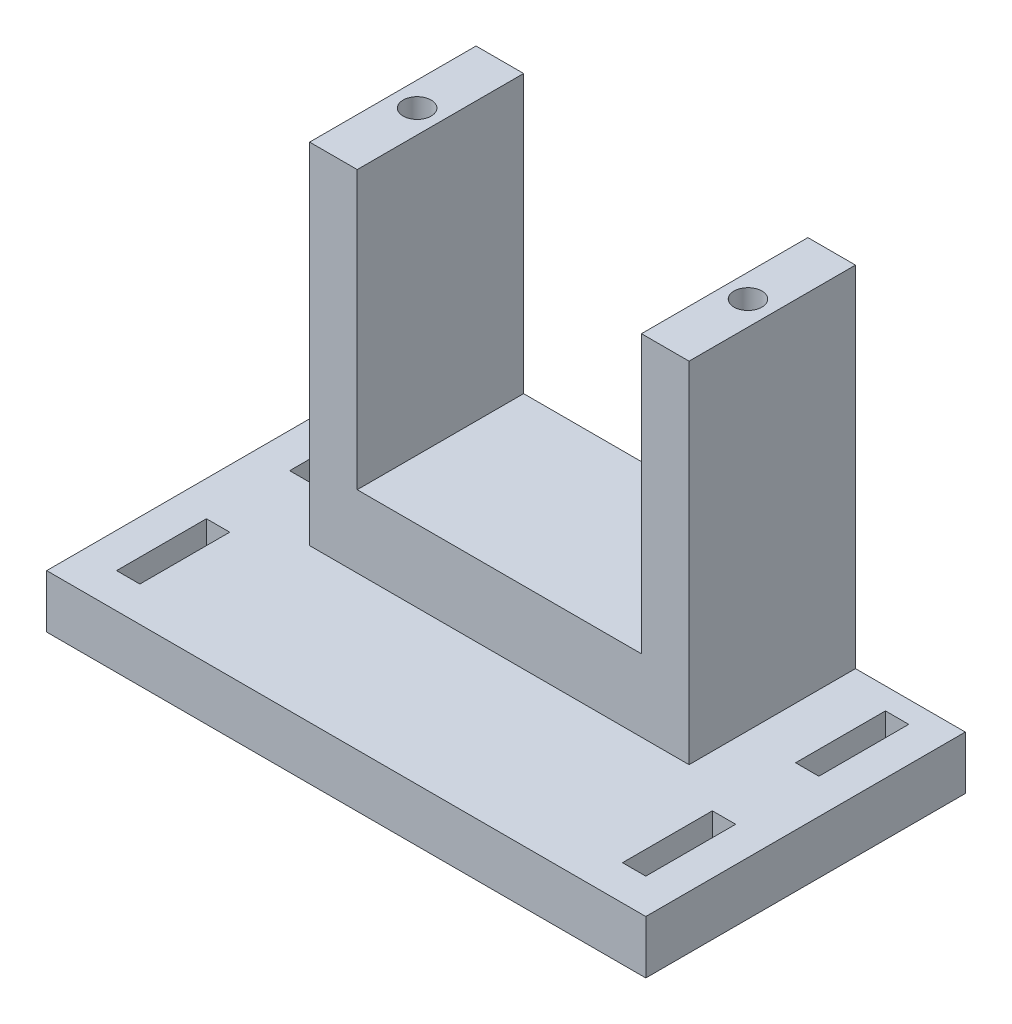
ISO-10303-21;
HEADER;
FILE_DESCRIPTION(('STEP AP214'),'2;1');
FILE_NAME('part.step','',(''),(''),'','','');
FILE_SCHEMA(('AUTOMOTIVE_DESIGN { 1 0 10303 214 1 1 1 1 }'));
ENDSEC;
DATA;
#1=APPLICATION_CONTEXT('core data for automotive mechanical design processes');
#2=APPLICATION_PROTOCOL_DEFINITION('international standard','automotive_design',2000,#1);
#3=PRODUCT_CONTEXT('',#1,'mechanical');
#4=PRODUCT('Part','Part','',(#3));
#5=PRODUCT_RELATED_PRODUCT_CATEGORY('part','',(#4));
#6=PRODUCT_DEFINITION_FORMATION('','',#4);
#7=PRODUCT_DEFINITION_CONTEXT('part definition',#1,'design');
#8=PRODUCT_DEFINITION('design','',#6,#7);
#9=PRODUCT_DEFINITION_SHAPE('','',#8);
#10=(LENGTH_UNIT() NAMED_UNIT(*) SI_UNIT(.MILLI.,.METRE.));
#11=(NAMED_UNIT(*) PLANE_ANGLE_UNIT() SI_UNIT($,.RADIAN.));
#12=(NAMED_UNIT(*) SI_UNIT($,.STERADIAN.) SOLID_ANGLE_UNIT());
#13=UNCERTAINTY_MEASURE_WITH_UNIT(LENGTH_MEASURE(1.E-05),#10,'distance_accuracy_value','');
#14=(GEOMETRIC_REPRESENTATION_CONTEXT(3) GLOBAL_UNCERTAINTY_ASSIGNED_CONTEXT((#13)) GLOBAL_UNIT_ASSIGNED_CONTEXT((#10,
#11,#12)) REPRESENTATION_CONTEXT('',''));
#15=CARTESIAN_POINT('',(0.,0.,0.));
#16=DIRECTION('',(0.,0.,1.));
#17=DIRECTION('',(1.,0.,0.));
#18=AXIS2_PLACEMENT_3D('',#15,#16,#17);
#19=CARTESIAN_POINT('',(36.25,0.,42.75));
#20=DIRECTION('',(0.,0.,1.));
#21=DIRECTION('',(1.,0.,0.));
#22=AXIS2_PLACEMENT_3D('',#19,#20,#21);
#23=PLANE('',#22);
#24=DIRECTION('',(1.,0.,0.));
#25=VECTOR('',#24,1.);
#26=CARTESIAN_POINT('',(36.25,8.,42.75));
#27=LINE('',#26,#25);
#28=CARTESIAN_POINT('',(36.25,8.,42.75));
#29=VERTEX_POINT('',#28);
#30=CARTESIAN_POINT('',(39.75,8.,42.75));
#31=VERTEX_POINT('',#30);
#32=EDGE_CURVE('E507',#29,#31,#27,.T.);
#33=ORIENTED_EDGE('',*,*,#32,.T.);
#34=DIRECTION('',(0.,1.,0.));
#35=VECTOR('',#34,1.);
#36=CARTESIAN_POINT('',(39.75,0.,42.75));
#37=LINE('',#36,#35);
#38=CARTESIAN_POINT('',(39.75,0.,42.75));
#39=VERTEX_POINT('',#38);
#40=EDGE_CURVE('E11',#39,#31,#37,.T.);
#41=ORIENTED_EDGE('',*,*,#40,.F.);
#42=DIRECTION('',(1.,0.,0.));
#43=VECTOR('',#42,1.);
#44=CARTESIAN_POINT('',(36.25,0.,42.75));
#45=LINE('',#44,#43);
#46=CARTESIAN_POINT('',(36.25,0.,42.75));
#47=VERTEX_POINT('',#46);
#48=EDGE_CURVE('E513',#47,#39,#45,.T.);
#49=ORIENTED_EDGE('',*,*,#48,.F.);
#50=DIRECTION('',(0.,1.,0.));
#51=VECTOR('',#50,1.);
#52=CARTESIAN_POINT('',(36.25,0.,42.75));
#53=LINE('',#52,#51);
#54=EDGE_CURVE('E523',#47,#29,#53,.T.);
#55=ORIENTED_EDGE('',*,*,#54,.T.);
#56=EDGE_LOOP('',(#33,#41,#49,#55));
#57=FACE_BOUND('',#56,.T.);
#58=ADVANCED_FACE('F44',(#57),#23,.F.);
#59=CARTESIAN_POINT('',(39.75,0.,29.25));
#60=DIRECTION('',(1.,0.,0.));
#61=DIRECTION('',(0.,0.,-1.));
#62=AXIS2_PLACEMENT_3D('',#59,#60,#61);
#63=PLANE('',#62);
#64=DIRECTION('',(0.,0.,-1.));
#65=VECTOR('',#64,1.);
#66=CARTESIAN_POINT('',(39.75,8.,29.25));
#67=LINE('',#66,#65);
#68=CARTESIAN_POINT('',(39.75,8.,29.25));
#69=VERTEX_POINT('',#68);
#70=EDGE_CURVE('E502',#31,#69,#67,.T.);
#71=ORIENTED_EDGE('',*,*,#70,.T.);
#72=DIRECTION('',(0.,1.,0.));
#73=VECTOR('',#72,1.);
#74=CARTESIAN_POINT('',(39.75,0.,29.25));
#75=LINE('',#74,#73);
#76=CARTESIAN_POINT('',(39.75,0.,29.25));
#77=VERTEX_POINT('',#76);
#78=EDGE_CURVE('E52',#77,#69,#75,.T.);
#79=ORIENTED_EDGE('',*,*,#78,.F.);
#80=DIRECTION('',(0.,0.,-1.));
#81=VECTOR('',#80,1.);
#82=CARTESIAN_POINT('',(39.75,0.,29.25));
#83=LINE('',#82,#81);
#84=EDGE_CURVE('E70',#39,#77,#83,.T.);
#85=ORIENTED_EDGE('',*,*,#84,.F.);
#86=ORIENTED_EDGE('',*,*,#40,.T.);
#87=EDGE_LOOP('',(#71,#79,#85,#86));
#88=FACE_BOUND('',#87,.T.);
#89=ADVANCED_FACE('F536',(#88),#63,.F.);
#90=CARTESIAN_POINT('',(36.25,0.,29.25));
#91=DIRECTION('',(0.,0.,-1.));
#92=DIRECTION('',(-1.,0.,0.));
#93=AXIS2_PLACEMENT_3D('',#90,#91,#92);
#94=PLANE('',#93);
#95=DIRECTION('',(-1.,0.,0.));
#96=VECTOR('',#95,1.);
#97=CARTESIAN_POINT('',(36.25,8.,29.25));
#98=LINE('',#97,#96);
#99=CARTESIAN_POINT('',(36.25,8.,29.25));
#100=VERTEX_POINT('',#99);
#101=EDGE_CURVE('E504',#69,#100,#98,.T.);
#102=ORIENTED_EDGE('',*,*,#101,.T.);
#103=DIRECTION('',(0.,1.,0.));
#104=VECTOR('',#103,1.);
#105=CARTESIAN_POINT('',(36.25,0.,29.25));
#106=LINE('',#105,#104);
#107=CARTESIAN_POINT('',(36.25,0.,29.25));
#108=VERTEX_POINT('',#107);
#109=EDGE_CURVE('E527',#108,#100,#106,.T.);
#110=ORIENTED_EDGE('',*,*,#109,.F.);
#111=DIRECTION('',(-1.,0.,0.));
#112=VECTOR('',#111,1.);
#113=CARTESIAN_POINT('',(36.25,0.,29.25));
#114=LINE('',#113,#112);
#115=EDGE_CURVE('E517',#77,#108,#114,.T.);
#116=ORIENTED_EDGE('',*,*,#115,.F.);
#117=ORIENTED_EDGE('',*,*,#78,.T.);
#118=EDGE_LOOP('',(#102,#110,#116,#117));
#119=FACE_BOUND('',#118,.T.);
#120=ADVANCED_FACE('F531',(#119),#94,.F.);
#121=CARTESIAN_POINT('',(36.25,0.,29.25));
#122=DIRECTION('',(-1.,0.,0.));
#123=DIRECTION('',(0.,0.,1.));
#124=AXIS2_PLACEMENT_3D('',#121,#122,#123);
#125=PLANE('',#124);
#126=DIRECTION('',(0.,0.,1.));
#127=VECTOR('',#126,1.);
#128=CARTESIAN_POINT('',(36.25,8.,29.25));
#129=LINE('',#128,#127);
#130=EDGE_CURVE('E499',#100,#29,#129,.T.);
#131=ORIENTED_EDGE('',*,*,#130,.T.);
#132=ORIENTED_EDGE('',*,*,#54,.F.);
#133=DIRECTION('',(0.,0.,1.));
#134=VECTOR('',#133,1.);
#135=CARTESIAN_POINT('',(36.25,0.,29.25));
#136=LINE('',#135,#134);
#137=EDGE_CURVE('E58',#108,#47,#136,.T.);
#138=ORIENTED_EDGE('',*,*,#137,.F.);
#139=ORIENTED_EDGE('',*,*,#109,.T.);
#140=EDGE_LOOP('',(#131,#132,#138,#139));
#141=FACE_BOUND('',#140,.T.);
#142=ADVANCED_FACE('F545',(#141),#125,.F.);
#143=CARTESIAN_POINT('',(-39.75,0.,42.75));
#144=DIRECTION('',(0.,0.,1.));
#145=DIRECTION('',(1.,0.,0.));
#146=AXIS2_PLACEMENT_3D('',#143,#144,#145);
#147=PLANE('',#146);
#148=DIRECTION('',(1.,0.,0.));
#149=VECTOR('',#148,1.);
#150=CARTESIAN_POINT('',(-39.75,8.,42.75));
#151=LINE('',#150,#149);
#152=CARTESIAN_POINT('',(-39.75,8.,42.75));
#153=VERTEX_POINT('',#152);
#154=CARTESIAN_POINT('',(-36.25,8.,42.75));
#155=VERTEX_POINT('',#154);
#156=EDGE_CURVE('E462',#153,#155,#151,.T.);
#157=ORIENTED_EDGE('',*,*,#156,.T.);
#158=DIRECTION('',(0.,1.,0.));
#159=VECTOR('',#158,1.);
#160=CARTESIAN_POINT('',(-36.25,0.,42.75));
#161=LINE('',#160,#159);
#162=CARTESIAN_POINT('',(-36.25,0.,42.75));
#163=VERTEX_POINT('',#162);
#164=EDGE_CURVE('E493',#163,#155,#161,.T.);
#165=ORIENTED_EDGE('',*,*,#164,.F.);
#166=DIRECTION('',(1.,0.,0.));
#167=VECTOR('',#166,1.);
#168=CARTESIAN_POINT('',(-39.75,0.,42.75));
#169=LINE('',#168,#167);
#170=CARTESIAN_POINT('',(-39.75,0.,42.75));
#171=VERTEX_POINT('',#170);
#172=EDGE_CURVE('E472',#171,#163,#169,.T.);
#173=ORIENTED_EDGE('',*,*,#172,.F.);
#174=DIRECTION('',(0.,1.,0.));
#175=VECTOR('',#174,1.);
#176=CARTESIAN_POINT('',(-39.75,0.,42.75));
#177=LINE('',#176,#175);
#178=EDGE_CURVE('E485',#171,#153,#177,.T.);
#179=ORIENTED_EDGE('',*,*,#178,.T.);
#180=EDGE_LOOP('',(#157,#165,#173,#179));
#181=FACE_BOUND('',#180,.T.);
#182=ADVANCED_FACE('F542',(#181),#147,.F.);
#183=CARTESIAN_POINT('',(-36.25,0.,29.25));
#184=DIRECTION('',(1.,0.,0.));
#185=DIRECTION('',(0.,0.,-1.));
#186=AXIS2_PLACEMENT_3D('',#183,#184,#185);
#187=PLANE('',#186);
#188=DIRECTION('',(0.,0.,-1.));
#189=VECTOR('',#188,1.);
#190=CARTESIAN_POINT('',(-36.25,8.,29.25));
#191=LINE('',#190,#189);
#192=CARTESIAN_POINT('',(-36.25,8.,29.25));
#193=VERTEX_POINT('',#192);
#194=EDGE_CURVE('E464',#155,#193,#191,.T.);
#195=ORIENTED_EDGE('',*,*,#194,.T.);
#196=DIRECTION('',(0.,1.,0.));
#197=VECTOR('',#196,1.);
#198=CARTESIAN_POINT('',(-36.25,0.,29.25));
#199=LINE('',#198,#197);
#200=CARTESIAN_POINT('',(-36.25,0.,29.25));
#201=VERTEX_POINT('',#200);
#202=EDGE_CURVE('E489',#201,#193,#199,.T.);
#203=ORIENTED_EDGE('',*,*,#202,.F.);
#204=DIRECTION('',(0.,0.,-1.));
#205=VECTOR('',#204,1.);
#206=CARTESIAN_POINT('',(-36.25,0.,29.25));
#207=LINE('',#206,#205);
#208=EDGE_CURVE('E474',#163,#201,#207,.T.);
#209=ORIENTED_EDGE('',*,*,#208,.F.);
#210=ORIENTED_EDGE('',*,*,#164,.T.);
#211=EDGE_LOOP('',(#195,#203,#209,#210));
#212=FACE_BOUND('',#211,.T.);
#213=ADVANCED_FACE('F549',(#212),#187,.F.);
#214=CARTESIAN_POINT('',(-39.75,0.,29.25));
#215=DIRECTION('',(0.,0.,-1.));
#216=DIRECTION('',(-1.,0.,0.));
#217=AXIS2_PLACEMENT_3D('',#214,#215,#216);
#218=PLANE('',#217);
#219=DIRECTION('',(-1.,0.,0.));
#220=VECTOR('',#219,1.);
#221=CARTESIAN_POINT('',(-39.75,8.,29.25));
#222=LINE('',#221,#220);
#223=CARTESIAN_POINT('',(-39.75,8.,29.25));
#224=VERTEX_POINT('',#223);
#225=EDGE_CURVE('E460',#193,#224,#222,.T.);
#226=ORIENTED_EDGE('',*,*,#225,.T.);
#227=DIRECTION('',(0.,1.,0.));
#228=VECTOR('',#227,1.);
#229=CARTESIAN_POINT('',(-39.75,0.,29.25));
#230=LINE('',#229,#228);
#231=CARTESIAN_POINT('',(-39.75,0.,29.25));
#232=VERTEX_POINT('',#231);
#233=EDGE_CURVE('E486',#232,#224,#230,.T.);
#234=ORIENTED_EDGE('',*,*,#233,.F.);
#235=DIRECTION('',(-1.,0.,0.));
#236=VECTOR('',#235,1.);
#237=CARTESIAN_POINT('',(-39.75,0.,29.25));
#238=LINE('',#237,#236);
#239=EDGE_CURVE('E476',#201,#232,#238,.T.);
#240=ORIENTED_EDGE('',*,*,#239,.F.);
#241=ORIENTED_EDGE('',*,*,#202,.T.);
#242=EDGE_LOOP('',(#226,#234,#240,#241));
#243=FACE_BOUND('',#242,.T.);
#244=ADVANCED_FACE('F588',(#243),#218,.F.);
#245=CARTESIAN_POINT('',(-39.75,0.,29.25));
#246=DIRECTION('',(-1.,0.,0.));
#247=DIRECTION('',(0.,0.,1.));
#248=AXIS2_PLACEMENT_3D('',#245,#246,#247);
#249=PLANE('',#248);
#250=DIRECTION('',(0.,0.,1.));
#251=VECTOR('',#250,1.);
#252=CARTESIAN_POINT('',(-39.75,8.,29.25));
#253=LINE('',#252,#251);
#254=EDGE_CURVE('E452',#224,#153,#253,.T.);
#255=ORIENTED_EDGE('',*,*,#254,.T.);
#256=ORIENTED_EDGE('',*,*,#178,.F.);
#257=DIRECTION('',(0.,0.,1.));
#258=VECTOR('',#257,1.);
#259=CARTESIAN_POINT('',(-39.75,0.,29.25));
#260=LINE('',#259,#258);
#261=EDGE_CURVE('E467',#232,#171,#260,.T.);
#262=ORIENTED_EDGE('',*,*,#261,.F.);
#263=ORIENTED_EDGE('',*,*,#233,.T.);
#264=EDGE_LOOP('',(#255,#256,#262,#263));
#265=FACE_BOUND('',#264,.T.);
#266=ADVANCED_FACE('F596',(#265),#249,.F.);
#267=CARTESIAN_POINT('',(-28.5,60.5,25.));
#268=DIRECTION('',(0.,-1.,0.));
#269=DIRECTION('',(0.,0.,-1.));
#270=AXIS2_PLACEMENT_3D('',#267,#268,#269);
#271=PLANE('',#270);
#272=CARTESIAN_POINT('',(-24.85,60.5,12.5));
#273=DIRECTION('',(0.,1.,0.));
#274=DIRECTION('',(0.,0.,1.));
#275=AXIS2_PLACEMENT_3D('',#272,#273,#274);
#276=CIRCLE('',#275,2.1);
#277=CARTESIAN_POINT('',(-24.85,60.5,14.6));
#278=VERTEX_POINT('',#277);
#279=EDGE_CURVE('E805',#278,#278,#276,.T.);
#280=ORIENTED_EDGE('',*,*,#279,.F.);
#281=EDGE_LOOP('',(#280));
#282=FACE_BOUND('',#281,.T.);
#283=DIRECTION('',(-1.,0.,0.));
#284=VECTOR('',#283,1.);
#285=CARTESIAN_POINT('',(-28.5,60.5,25.));
#286=LINE('',#285,#284);
#287=CARTESIAN_POINT('',(-21.35,60.5,25.));
#288=VERTEX_POINT('',#287);
#289=CARTESIAN_POINT('',(-28.5,60.5,25.));
#290=VERTEX_POINT('',#289);
#291=EDGE_CURVE('E416',#288,#290,#286,.T.);
#292=ORIENTED_EDGE('',*,*,#291,.F.);
#293=DIRECTION('',(0.,0.,-1.));
#294=VECTOR('',#293,1.);
#295=CARTESIAN_POINT('',(-21.35,60.5,25.));
#296=LINE('',#295,#294);
#297=CARTESIAN_POINT('',(-21.35,60.5,0.));
#298=VERTEX_POINT('',#297);
#299=EDGE_CURVE('E449',#288,#298,#296,.T.);
#300=ORIENTED_EDGE('',*,*,#299,.T.);
#301=DIRECTION('',(-1.,0.,0.));
#302=VECTOR('',#301,1.);
#303=CARTESIAN_POINT('',(-28.5,60.5,0.));
#304=LINE('',#303,#302);
#305=CARTESIAN_POINT('',(-28.5,60.5,0.));
#306=VERTEX_POINT('',#305);
#307=EDGE_CURVE('E433',#298,#306,#304,.T.);
#308=ORIENTED_EDGE('',*,*,#307,.T.);
#309=DIRECTION('',(0.,0.,-1.));
#310=VECTOR('',#309,1.);
#311=CARTESIAN_POINT('',(-28.5,60.5,25.));
#312=LINE('',#311,#310);
#313=EDGE_CURVE('E421',#290,#306,#312,.T.);
#314=ORIENTED_EDGE('',*,*,#313,.F.);
#315=EDGE_LOOP('',(#292,#300,#308,#314));
#316=FACE_BOUND('',#315,.T.);
#317=ADVANCED_FACE('F607',(#282,#316),#271,.F.);
#318=CARTESIAN_POINT('',(0.,0.,25.));
#319=DIRECTION('',(0.,0.,-1.));
#320=DIRECTION('',(-1.,0.,0.));
#321=AXIS2_PLACEMENT_3D('',#318,#319,#320);
#322=PLANE('',#321);
#323=DIRECTION('',(0.,-1.,0.));
#324=VECTOR('',#323,1.);
#325=CARTESIAN_POINT('',(-28.5,0.,25.));
#326=LINE('',#325,#324);
#327=CARTESIAN_POINT('',(-28.5,8.,25.));
#328=VERTEX_POINT('',#327);
#329=EDGE_CURVE('E407',#290,#328,#326,.T.);
#330=ORIENTED_EDGE('',*,*,#329,.T.);
#331=DIRECTION('',(1.,0.,0.));
#332=VECTOR('',#331,1.);
#333=CARTESIAN_POINT('',(0.,8.,25.));
#334=LINE('',#333,#332);
#335=CARTESIAN_POINT('',(28.5,8.,25.));
#336=VERTEX_POINT('',#335);
#337=EDGE_CURVE('E367',#328,#336,#334,.T.);
#338=ORIENTED_EDGE('',*,*,#337,.T.);
#339=DIRECTION('',(0.,1.,0.));
#340=VECTOR('',#339,1.);
#341=CARTESIAN_POINT('',(28.5,0.,25.));
#342=LINE('',#341,#340);
#343=CARTESIAN_POINT('',(28.5,60.5,25.));
#344=VERTEX_POINT('',#343);
#345=EDGE_CURVE('E412',#336,#344,#342,.T.);
#346=ORIENTED_EDGE('',*,*,#345,.T.);
#347=CARTESIAN_POINT('',(21.35,60.5,25.));
#348=VERTEX_POINT('',#347);
#349=EDGE_CURVE('E420',#344,#348,#286,.T.);
#350=ORIENTED_EDGE('',*,*,#349,.T.);
#351=DIRECTION('',(0.,1.,0.));
#352=VECTOR('',#351,1.);
#353=CARTESIAN_POINT('',(21.35,18.85,25.));
#354=LINE('',#353,#352);
#355=CARTESIAN_POINT('',(21.35,18.85,25.));
#356=VERTEX_POINT('',#355);
#357=EDGE_CURVE('E388',#356,#348,#354,.T.);
#358=ORIENTED_EDGE('',*,*,#357,.F.);
#359=DIRECTION('',(1.,0.,0.));
#360=VECTOR('',#359,1.);
#361=CARTESIAN_POINT('',(-21.35,18.85,25.));
#362=LINE('',#361,#360);
#363=CARTESIAN_POINT('',(-21.35,18.85,25.));
#364=VERTEX_POINT('',#363);
#365=EDGE_CURVE('E378',#364,#356,#362,.T.);
#366=ORIENTED_EDGE('',*,*,#365,.F.);
#367=DIRECTION('',(0.,-1.,0.));
#368=VECTOR('',#367,1.);
#369=CARTESIAN_POINT('',(-21.35,18.85,25.));
#370=LINE('',#369,#368);
#371=EDGE_CURVE('E382',#288,#364,#370,.T.);
#372=ORIENTED_EDGE('',*,*,#371,.F.);
#373=ORIENTED_EDGE('',*,*,#291,.T.);
#374=EDGE_LOOP('',(#330,#338,#346,#350,#358,#366,#372,#373));
#375=FACE_BOUND('',#374,.T.);
#376=ADVANCED_FACE('F733',(#375),#322,.F.);
#377=CARTESIAN_POINT('',(0.,0.,0.));
#378=DIRECTION('',(0.,0.,-1.));
#379=DIRECTION('',(-1.,0.,0.));
#380=AXIS2_PLACEMENT_3D('',#377,#378,#379);
#381=PLANE('',#380);
#382=DIRECTION('',(1.,0.,0.));
#383=VECTOR('',#382,1.);
#384=CARTESIAN_POINT('',(-28.5,0.,0.));
#385=LINE('',#384,#383);
#386=CARTESIAN_POINT('',(-45.,0.,0.));
#387=VERTEX_POINT('',#386);
#388=CARTESIAN_POINT('',(45.,0.,0.));
#389=VERTEX_POINT('',#388);
#390=EDGE_CURVE('E430',#387,#389,#385,.T.);
#391=ORIENTED_EDGE('',*,*,#390,.F.);
#392=DIRECTION('',(0.,-1.,0.));
#393=VECTOR('',#392,1.);
#394=CARTESIAN_POINT('',(-45.,8.,0.));
#395=LINE('',#394,#393);
#396=CARTESIAN_POINT('',(-45.,8.,0.));
#397=VERTEX_POINT('',#396);
#398=EDGE_CURVE('E344',#397,#387,#395,.T.);
#399=ORIENTED_EDGE('',*,*,#398,.F.);
#400=DIRECTION('',(-1.,0.,0.));
#401=VECTOR('',#400,1.);
#402=CARTESIAN_POINT('',(-45.,8.,0.));
#403=LINE('',#402,#401);
#404=CARTESIAN_POINT('',(-28.5,8.,0.));
#405=VERTEX_POINT('',#404);
#406=EDGE_CURVE('E341',#405,#397,#403,.T.);
#407=ORIENTED_EDGE('',*,*,#406,.F.);
#408=DIRECTION('',(0.,-1.,0.));
#409=VECTOR('',#408,1.);
#410=CARTESIAN_POINT('',(-28.5,0.,0.));
#411=LINE('',#410,#409);
#412=EDGE_CURVE('E409',#306,#405,#411,.T.);
#413=ORIENTED_EDGE('',*,*,#412,.F.);
#414=ORIENTED_EDGE('',*,*,#307,.F.);
#415=DIRECTION('',(0.,-1.,0.));
#416=VECTOR('',#415,1.);
#417=CARTESIAN_POINT('',(-21.35,18.85,0.));
#418=LINE('',#417,#416);
#419=CARTESIAN_POINT('',(-21.35,18.85,0.));
#420=VERTEX_POINT('',#419);
#421=EDGE_CURVE('E377',#298,#420,#418,.T.);
#422=ORIENTED_EDGE('',*,*,#421,.T.);
#423=DIRECTION('',(1.,0.,0.));
#424=VECTOR('',#423,1.);
#425=CARTESIAN_POINT('',(-21.35,18.85,0.));
#426=LINE('',#425,#424);
#427=CARTESIAN_POINT('',(21.35,18.85,0.));
#428=VERTEX_POINT('',#427);
#429=EDGE_CURVE('E384',#420,#428,#426,.T.);
#430=ORIENTED_EDGE('',*,*,#429,.T.);
#431=DIRECTION('',(0.,1.,0.));
#432=VECTOR('',#431,1.);
#433=CARTESIAN_POINT('',(21.35,18.85,0.));
#434=LINE('',#433,#432);
#435=CARTESIAN_POINT('',(21.35,60.5,0.));
#436=VERTEX_POINT('',#435);
#437=EDGE_CURVE('E386',#428,#436,#434,.T.);
#438=ORIENTED_EDGE('',*,*,#437,.T.);
#439=CARTESIAN_POINT('',(28.5,60.5,0.));
#440=VERTEX_POINT('',#439);
#441=EDGE_CURVE('E414',#440,#436,#304,.T.);
#442=ORIENTED_EDGE('',*,*,#441,.F.);
#443=DIRECTION('',(0.,1.,0.));
#444=VECTOR('',#443,1.);
#445=CARTESIAN_POINT('',(28.5,0.,0.));
#446=LINE('',#445,#444);
#447=CARTESIAN_POINT('',(28.5,8.,0.));
#448=VERTEX_POINT('',#447);
#449=EDGE_CURVE('E429',#448,#440,#446,.T.);
#450=ORIENTED_EDGE('',*,*,#449,.F.);
#451=CARTESIAN_POINT('',(45.,8.,0.));
#452=VERTEX_POINT('',#451);
#453=EDGE_CURVE('E345',#452,#448,#403,.T.);
#454=ORIENTED_EDGE('',*,*,#453,.F.);
#455=DIRECTION('',(0.,-1.,0.));
#456=VECTOR('',#455,1.);
#457=CARTESIAN_POINT('',(45.,8.,0.));
#458=LINE('',#457,#456);
#459=EDGE_CURVE('E358',#452,#389,#458,.T.);
#460=ORIENTED_EDGE('',*,*,#459,.T.);
#461=EDGE_LOOP('',(#391,#399,#407,#413,#414,#422,#430,#438,#442,#450,#454,#460));
#462=FACE_BOUND('',#461,.T.);
#463=ADVANCED_FACE('F740',(#462),#381,.T.);
#464=CARTESIAN_POINT('',(-28.5,0.,25.));
#465=DIRECTION('',(1.,0.,0.));
#466=DIRECTION('',(0.,0.,-1.));
#467=AXIS2_PLACEMENT_3D('',#464,#465,#466);
#468=PLANE('',#467);
#469=ORIENTED_EDGE('',*,*,#412,.T.);
#470=DIRECTION('',(0.,0.,1.));
#471=VECTOR('',#470,1.);
#472=CARTESIAN_POINT('',(-28.5,8.,25.));
#473=LINE('',#472,#471);
#474=EDGE_CURVE('E372',#405,#328,#473,.T.);
#475=ORIENTED_EDGE('',*,*,#474,.T.);
#476=ORIENTED_EDGE('',*,*,#329,.F.);
#477=ORIENTED_EDGE('',*,*,#313,.T.);
#478=EDGE_LOOP('',(#469,#475,#476,#477));
#479=FACE_BOUND('',#478,.T.);
#480=ADVANCED_FACE('F745',(#479),#468,.F.);
#481=CARTESIAN_POINT('',(-28.5,0.,25.));
#482=DIRECTION('',(0.,1.,0.));
#483=DIRECTION('',(0.,0.,1.));
#484=AXIS2_PLACEMENT_3D('',#481,#482,#483);
#485=PLANE('',#484);
#486=DIRECTION('',(-1.,0.,0.));
#487=VECTOR('',#486,1.);
#488=CARTESIAN_POINT('',(36.25,0.,3.25));
#489=LINE('',#488,#487);
#490=CARTESIAN_POINT('',(39.75,0.,3.25));
#491=VERTEX_POINT('',#490);
#492=CARTESIAN_POINT('',(36.25,0.,3.25));
#493=VERTEX_POINT('',#492);
#494=EDGE_CURVE('E273',#491,#493,#489,.T.);
#495=ORIENTED_EDGE('',*,*,#494,.T.);
#496=DIRECTION('',(0.,0.,1.));
#497=VECTOR('',#496,1.);
#498=CARTESIAN_POINT('',(36.25,0.,3.25));
#499=LINE('',#498,#497);
#500=CARTESIAN_POINT('',(36.25,0.,16.75));
#501=VERTEX_POINT('',#500);
#502=EDGE_CURVE('E284',#493,#501,#499,.T.);
#503=ORIENTED_EDGE('',*,*,#502,.T.);
#504=DIRECTION('',(1.,0.,0.));
#505=VECTOR('',#504,1.);
#506=CARTESIAN_POINT('',(36.25,0.,16.75));
#507=LINE('',#506,#505);
#508=CARTESIAN_POINT('',(39.75,0.,16.75));
#509=VERTEX_POINT('',#508);
#510=EDGE_CURVE('E245',#501,#509,#507,.T.);
#511=ORIENTED_EDGE('',*,*,#510,.T.);
#512=DIRECTION('',(0.,0.,-1.));
#513=VECTOR('',#512,1.);
#514=CARTESIAN_POINT('',(39.75,0.,3.25));
#515=LINE('',#514,#513);
#516=EDGE_CURVE('E253',#509,#491,#515,.T.);
#517=ORIENTED_EDGE('',*,*,#516,.T.);
#518=EDGE_LOOP('',(#495,#503,#511,#517));
#519=FACE_BOUND('',#518,.T.);
#520=DIRECTION('',(-1.,0.,0.));
#521=VECTOR('',#520,1.);
#522=CARTESIAN_POINT('',(-39.75,0.,3.25));
#523=LINE('',#522,#521);
#524=CARTESIAN_POINT('',(-36.25,0.,3.25));
#525=VERTEX_POINT('',#524);
#526=CARTESIAN_POINT('',(-39.75,0.,3.25));
#527=VERTEX_POINT('',#526);
#528=EDGE_CURVE('E298',#525,#527,#523,.T.);
#529=ORIENTED_EDGE('',*,*,#528,.T.);
#530=DIRECTION('',(0.,0.,1.));
#531=VECTOR('',#530,1.);
#532=CARTESIAN_POINT('',(-39.75,0.,3.25));
#533=LINE('',#532,#531);
#534=CARTESIAN_POINT('',(-39.75,0.,16.75));
#535=VERTEX_POINT('',#534);
#536=EDGE_CURVE('E286',#527,#535,#533,.T.);
#537=ORIENTED_EDGE('',*,*,#536,.T.);
#538=DIRECTION('',(1.,0.,0.));
#539=VECTOR('',#538,1.);
#540=CARTESIAN_POINT('',(-39.75,0.,16.75));
#541=LINE('',#540,#539);
#542=CARTESIAN_POINT('',(-36.25,0.,16.75));
#543=VERTEX_POINT('',#542);
#544=EDGE_CURVE('E289',#535,#543,#541,.T.);
#545=ORIENTED_EDGE('',*,*,#544,.T.);
#546=DIRECTION('',(0.,0.,-1.));
#547=VECTOR('',#546,1.);
#548=CARTESIAN_POINT('',(-36.25,0.,3.25));
#549=LINE('',#548,#547);
#550=EDGE_CURVE('E293',#543,#525,#549,.T.);
#551=ORIENTED_EDGE('',*,*,#550,.T.);
#552=EDGE_LOOP('',(#529,#537,#545,#551));
#553=FACE_BOUND('',#552,.T.);
#554=ORIENTED_EDGE('',*,*,#390,.T.);
#555=DIRECTION('',(0.,0.,-1.));
#556=VECTOR('',#555,1.);
#557=CARTESIAN_POINT('',(45.,0.,0.));
#558=LINE('',#557,#556);
#559=CARTESIAN_POINT('',(45.,0.,48.));
#560=VERTEX_POINT('',#559);
#561=EDGE_CURVE('E333',#560,#389,#558,.T.);
#562=ORIENTED_EDGE('',*,*,#561,.F.);
#563=DIRECTION('',(1.,0.,0.));
#564=VECTOR('',#563,1.);
#565=CARTESIAN_POINT('',(-45.,0.,48.));
#566=LINE('',#565,#564);
#567=CARTESIAN_POINT('',(-45.,0.,48.));
#568=VERTEX_POINT('',#567);
#569=EDGE_CURVE('E349',#568,#560,#566,.T.);
#570=ORIENTED_EDGE('',*,*,#569,.F.);
#571=DIRECTION('',(0.,0.,1.));
#572=VECTOR('',#571,1.);
#573=CARTESIAN_POINT('',(-45.,0.,0.));
#574=LINE('',#573,#572);
#575=EDGE_CURVE('E319',#387,#568,#574,.T.);
#576=ORIENTED_EDGE('',*,*,#575,.F.);
#577=EDGE_LOOP('',(#554,#562,#570,#576));
#578=FACE_BOUND('',#577,.T.);
#579=ORIENTED_EDGE('',*,*,#261,.T.);
#580=ORIENTED_EDGE('',*,*,#172,.T.);
#581=ORIENTED_EDGE('',*,*,#208,.T.);
#582=ORIENTED_EDGE('',*,*,#239,.T.);
#583=EDGE_LOOP('',(#579,#580,#581,#582));
#584=FACE_BOUND('',#583,.T.);
#585=ORIENTED_EDGE('',*,*,#137,.T.);
#586=ORIENTED_EDGE('',*,*,#48,.T.);
#587=ORIENTED_EDGE('',*,*,#84,.T.);
#588=ORIENTED_EDGE('',*,*,#115,.T.);
#589=EDGE_LOOP('',(#585,#586,#587,#588));
#590=FACE_BOUND('',#589,.T.);
#591=ADVANCED_FACE('F750',(#519,#553,#578,#584,#590),#485,.F.);
#592=CARTESIAN_POINT('',(28.5,0.,25.));
#593=DIRECTION('',(-1.,0.,0.));
#594=DIRECTION('',(0.,0.,1.));
#595=AXIS2_PLACEMENT_3D('',#592,#593,#594);
#596=PLANE('',#595);
#597=ORIENTED_EDGE('',*,*,#345,.F.);
#598=DIRECTION('',(0.,0.,-1.));
#599=VECTOR('',#598,1.);
#600=CARTESIAN_POINT('',(28.5,8.,25.));
#601=LINE('',#600,#599);
#602=EDGE_CURVE('E447',#336,#448,#601,.T.);
#603=ORIENTED_EDGE('',*,*,#602,.T.);
#604=ORIENTED_EDGE('',*,*,#449,.T.);
#605=DIRECTION('',(0.,0.,-1.));
#606=VECTOR('',#605,1.);
#607=CARTESIAN_POINT('',(28.5,60.5,25.));
#608=LINE('',#607,#606);
#609=EDGE_CURVE('E383',#344,#440,#608,.T.);
#610=ORIENTED_EDGE('',*,*,#609,.F.);
#611=EDGE_LOOP('',(#597,#603,#604,#610));
#612=FACE_BOUND('',#611,.T.);
#613=ADVANCED_FACE('F744',(#612),#596,.F.);
#614=CARTESIAN_POINT('',(24.85,60.5,12.5));
#615=DIRECTION('',(0.,1.,0.));
#616=DIRECTION('',(0.,0.,1.));
#617=AXIS2_PLACEMENT_3D('',#614,#615,#616);
#618=CIRCLE('',#617,2.1);
#619=CARTESIAN_POINT('',(24.85,60.5,14.6));
#620=VERTEX_POINT('',#619);
#621=EDGE_CURVE('E810',#620,#620,#618,.T.);
#622=ORIENTED_EDGE('',*,*,#621,.F.);
#623=EDGE_LOOP('',(#622));
#624=FACE_BOUND('',#623,.T.);
#625=ORIENTED_EDGE('',*,*,#441,.T.);
#626=DIRECTION('',(0.,0.,1.));
#627=VECTOR('',#626,1.);
#628=CARTESIAN_POINT('',(21.35,60.5,25.));
#629=LINE('',#628,#627);
#630=EDGE_CURVE('E400',#436,#348,#629,.T.);
#631=ORIENTED_EDGE('',*,*,#630,.T.);
#632=ORIENTED_EDGE('',*,*,#349,.F.);
#633=ORIENTED_EDGE('',*,*,#609,.T.);
#634=EDGE_LOOP('',(#625,#631,#632,#633));
#635=FACE_BOUND('',#634,.T.);
#636=ADVANCED_FACE('F731',(#624,#635),#271,.F.);
#637=CARTESIAN_POINT('',(-21.35,18.85,0.));
#638=DIRECTION('',(-1.,0.,0.));
#639=DIRECTION('',(0.,0.,1.));
#640=AXIS2_PLACEMENT_3D('',#637,#638,#639);
#641=PLANE('',#640);
#642=ORIENTED_EDGE('',*,*,#371,.T.);
#643=DIRECTION('',(0.,0.,1.));
#644=VECTOR('',#643,1.);
#645=CARTESIAN_POINT('',(-21.35,18.85,0.));
#646=LINE('',#645,#644);
#647=EDGE_CURVE('E393',#420,#364,#646,.T.);
#648=ORIENTED_EDGE('',*,*,#647,.F.);
#649=ORIENTED_EDGE('',*,*,#421,.F.);
#650=ORIENTED_EDGE('',*,*,#299,.F.);
#651=EDGE_LOOP('',(#642,#648,#649,#650));
#652=FACE_BOUND('',#651,.T.);
#653=ADVANCED_FACE('F726',(#652),#641,.F.);
#654=CARTESIAN_POINT('',(21.35,18.85,0.));
#655=DIRECTION('',(1.,0.,0.));
#656=DIRECTION('',(0.,0.,-1.));
#657=AXIS2_PLACEMENT_3D('',#654,#655,#656);
#658=PLANE('',#657);
#659=ORIENTED_EDGE('',*,*,#437,.F.);
#660=DIRECTION('',(0.,0.,1.));
#661=VECTOR('',#660,1.);
#662=CARTESIAN_POINT('',(21.35,18.85,0.));
#663=LINE('',#662,#661);
#664=EDGE_CURVE('E401',#428,#356,#663,.T.);
#665=ORIENTED_EDGE('',*,*,#664,.T.);
#666=ORIENTED_EDGE('',*,*,#357,.T.);
#667=ORIENTED_EDGE('',*,*,#630,.F.);
#668=EDGE_LOOP('',(#659,#665,#666,#667));
#669=FACE_BOUND('',#668,.T.);
#670=ADVANCED_FACE('F725',(#669),#658,.F.);
#671=CARTESIAN_POINT('',(-21.35,18.85,0.));
#672=DIRECTION('',(0.,-1.,0.));
#673=DIRECTION('',(0.,0.,-1.));
#674=AXIS2_PLACEMENT_3D('',#671,#672,#673);
#675=PLANE('',#674);
#676=ORIENTED_EDGE('',*,*,#365,.T.);
#677=ORIENTED_EDGE('',*,*,#664,.F.);
#678=ORIENTED_EDGE('',*,*,#429,.F.);
#679=ORIENTED_EDGE('',*,*,#647,.T.);
#680=EDGE_LOOP('',(#676,#677,#678,#679));
#681=FACE_BOUND('',#680,.T.);
#682=ADVANCED_FACE('F715',(#681),#675,.F.);
#683=CARTESIAN_POINT('',(0.,8.,0.));
#684=DIRECTION('',(0.,1.,0.));
#685=DIRECTION('',(0.,0.,1.));
#686=AXIS2_PLACEMENT_3D('',#683,#684,#685);
#687=PLANE('',#686);
#688=DIRECTION('',(0.,0.,1.));
#689=VECTOR('',#688,1.);
#690=CARTESIAN_POINT('',(36.25,8.,3.25));
#691=LINE('',#690,#689);
#692=CARTESIAN_POINT('',(36.25,8.,3.25));
#693=VERTEX_POINT('',#692);
#694=CARTESIAN_POINT('',(36.25,8.,16.75));
#695=VERTEX_POINT('',#694);
#696=EDGE_CURVE('E279',#693,#695,#691,.T.);
#697=ORIENTED_EDGE('',*,*,#696,.F.);
#698=DIRECTION('',(-1.,0.,0.));
#699=VECTOR('',#698,1.);
#700=CARTESIAN_POINT('',(36.25,8.,3.25));
#701=LINE('',#700,#699);
#702=CARTESIAN_POINT('',(39.75,8.,3.25));
#703=VERTEX_POINT('',#702);
#704=EDGE_CURVE('E260',#703,#693,#701,.T.);
#705=ORIENTED_EDGE('',*,*,#704,.F.);
#706=DIRECTION('',(0.,0.,-1.));
#707=VECTOR('',#706,1.);
#708=CARTESIAN_POINT('',(39.75,8.,3.25));
#709=LINE('',#708,#707);
#710=CARTESIAN_POINT('',(39.75,8.,16.75));
#711=VERTEX_POINT('',#710);
#712=EDGE_CURVE('E248',#711,#703,#709,.T.);
#713=ORIENTED_EDGE('',*,*,#712,.F.);
#714=DIRECTION('',(1.,0.,0.));
#715=VECTOR('',#714,1.);
#716=CARTESIAN_POINT('',(36.25,8.,16.75));
#717=LINE('',#716,#715);
#718=EDGE_CURVE('E235',#695,#711,#717,.T.);
#719=ORIENTED_EDGE('',*,*,#718,.F.);
#720=EDGE_LOOP('',(#697,#705,#713,#719));
#721=FACE_BOUND('',#720,.T.);
#722=DIRECTION('',(0.,0.,1.));
#723=VECTOR('',#722,1.);
#724=CARTESIAN_POINT('',(-39.75,8.,3.25));
#725=LINE('',#724,#723);
#726=CARTESIAN_POINT('',(-39.75,8.,3.25));
#727=VERTEX_POINT('',#726);
#728=CARTESIAN_POINT('',(-39.75,8.,16.75));
#729=VERTEX_POINT('',#728);
#730=EDGE_CURVE('E282',#727,#729,#725,.T.);
#731=ORIENTED_EDGE('',*,*,#730,.F.);
#732=DIRECTION('',(-1.,0.,0.));
#733=VECTOR('',#732,1.);
#734=CARTESIAN_POINT('',(-39.75,8.,3.25));
#735=LINE('',#734,#733);
#736=CARTESIAN_POINT('',(-36.25,8.,3.25));
#737=VERTEX_POINT('',#736);
#738=EDGE_CURVE('E292',#737,#727,#735,.T.);
#739=ORIENTED_EDGE('',*,*,#738,.F.);
#740=DIRECTION('',(0.,0.,-1.));
#741=VECTOR('',#740,1.);
#742=CARTESIAN_POINT('',(-36.25,8.,3.25));
#743=LINE('',#742,#741);
#744=CARTESIAN_POINT('',(-36.25,8.,16.75));
#745=VERTEX_POINT('',#744);
#746=EDGE_CURVE('E309',#745,#737,#743,.T.);
#747=ORIENTED_EDGE('',*,*,#746,.F.);
#748=DIRECTION('',(1.,0.,0.));
#749=VECTOR('',#748,1.);
#750=CARTESIAN_POINT('',(-39.75,8.,16.75));
#751=LINE('',#750,#749);
#752=EDGE_CURVE('E308',#729,#745,#751,.T.);
#753=ORIENTED_EDGE('',*,*,#752,.F.);
#754=EDGE_LOOP('',(#731,#739,#747,#753));
#755=FACE_BOUND('',#754,.T.);
#756=ORIENTED_EDGE('',*,*,#474,.F.);
#757=ORIENTED_EDGE('',*,*,#406,.T.);
#758=DIRECTION('',(0.,0.,1.));
#759=VECTOR('',#758,1.);
#760=CARTESIAN_POINT('',(-45.,8.,0.));
#761=LINE('',#760,#759);
#762=CARTESIAN_POINT('',(-45.,8.,48.));
#763=VERTEX_POINT('',#762);
#764=EDGE_CURVE('E329',#397,#763,#761,.T.);
#765=ORIENTED_EDGE('',*,*,#764,.T.);
#766=DIRECTION('',(1.,0.,0.));
#767=VECTOR('',#766,1.);
#768=CARTESIAN_POINT('',(-45.,8.,48.));
#769=LINE('',#768,#767);
#770=CARTESIAN_POINT('',(45.,8.,48.));
#771=VERTEX_POINT('',#770);
#772=EDGE_CURVE('E331',#763,#771,#769,.T.);
#773=ORIENTED_EDGE('',*,*,#772,.T.);
#774=DIRECTION('',(0.,0.,-1.));
#775=VECTOR('',#774,1.);
#776=CARTESIAN_POINT('',(45.,8.,0.));
#777=LINE('',#776,#775);
#778=EDGE_CURVE('E340',#771,#452,#777,.T.);
#779=ORIENTED_EDGE('',*,*,#778,.T.);
#780=ORIENTED_EDGE('',*,*,#453,.T.);
#781=ORIENTED_EDGE('',*,*,#602,.F.);
#782=ORIENTED_EDGE('',*,*,#337,.F.);
#783=EDGE_LOOP('',(#756,#757,#765,#773,#779,#780,#781,#782));
#784=FACE_BOUND('',#783,.T.);
#785=ORIENTED_EDGE('',*,*,#254,.F.);
#786=ORIENTED_EDGE('',*,*,#225,.F.);
#787=ORIENTED_EDGE('',*,*,#194,.F.);
#788=ORIENTED_EDGE('',*,*,#156,.F.);
#789=EDGE_LOOP('',(#785,#786,#787,#788));
#790=FACE_BOUND('',#789,.T.);
#791=ORIENTED_EDGE('',*,*,#130,.F.);
#792=ORIENTED_EDGE('',*,*,#101,.F.);
#793=ORIENTED_EDGE('',*,*,#70,.F.);
#794=ORIENTED_EDGE('',*,*,#32,.F.);
#795=EDGE_LOOP('',(#791,#792,#793,#794));
#796=FACE_BOUND('',#795,.T.);
#797=ADVANCED_FACE('F254',(#721,#755,#784,#790,#796),#687,.T.);
#798=CARTESIAN_POINT('',(-45.,8.,0.));
#799=DIRECTION('',(1.,0.,0.));
#800=DIRECTION('',(0.,0.,-1.));
#801=AXIS2_PLACEMENT_3D('',#798,#799,#800);
#802=PLANE('',#801);
#803=ORIENTED_EDGE('',*,*,#575,.T.);
#804=DIRECTION('',(0.,-1.,0.));
#805=VECTOR('',#804,1.);
#806=CARTESIAN_POINT('',(-45.,8.,48.));
#807=LINE('',#806,#805);
#808=EDGE_CURVE('E368',#763,#568,#807,.T.);
#809=ORIENTED_EDGE('',*,*,#808,.F.);
#810=ORIENTED_EDGE('',*,*,#764,.F.);
#811=ORIENTED_EDGE('',*,*,#398,.T.);
#812=EDGE_LOOP('',(#803,#809,#810,#811));
#813=FACE_BOUND('',#812,.T.);
#814=ADVANCED_FACE('F711',(#813),#802,.F.);
#815=CARTESIAN_POINT('',(-45.,8.,48.));
#816=DIRECTION('',(0.,0.,-1.));
#817=DIRECTION('',(-1.,0.,0.));
#818=AXIS2_PLACEMENT_3D('',#815,#816,#817);
#819=PLANE('',#818);
#820=ORIENTED_EDGE('',*,*,#569,.T.);
#821=DIRECTION('',(0.,-1.,0.));
#822=VECTOR('',#821,1.);
#823=CARTESIAN_POINT('',(45.,8.,48.));
#824=LINE('',#823,#822);
#825=EDGE_CURVE('E362',#771,#560,#824,.T.);
#826=ORIENTED_EDGE('',*,*,#825,.F.);
#827=ORIENTED_EDGE('',*,*,#772,.F.);
#828=ORIENTED_EDGE('',*,*,#808,.T.);
#829=EDGE_LOOP('',(#820,#826,#827,#828));
#830=FACE_BOUND('',#829,.T.);
#831=ADVANCED_FACE('F714',(#830),#819,.F.);
#832=CARTESIAN_POINT('',(45.,8.,0.));
#833=DIRECTION('',(-1.,0.,0.));
#834=DIRECTION('',(0.,0.,1.));
#835=AXIS2_PLACEMENT_3D('',#832,#833,#834);
#836=PLANE('',#835);
#837=ORIENTED_EDGE('',*,*,#561,.T.);
#838=ORIENTED_EDGE('',*,*,#459,.F.);
#839=ORIENTED_EDGE('',*,*,#778,.F.);
#840=ORIENTED_EDGE('',*,*,#825,.T.);
#841=EDGE_LOOP('',(#837,#838,#839,#840));
#842=FACE_BOUND('',#841,.T.);
#843=ADVANCED_FACE('F708',(#842),#836,.F.);
#844=CARTESIAN_POINT('',(-39.75,0.,3.25));
#845=DIRECTION('',(-1.,0.,0.));
#846=DIRECTION('',(0.,0.,1.));
#847=AXIS2_PLACEMENT_3D('',#844,#845,#846);
#848=PLANE('',#847);
#849=ORIENTED_EDGE('',*,*,#730,.T.);
#850=DIRECTION('',(0.,1.,0.));
#851=VECTOR('',#850,1.);
#852=CARTESIAN_POINT('',(-39.75,0.,16.75));
#853=LINE('',#852,#851);
#854=EDGE_CURVE('E303',#535,#729,#853,.T.);
#855=ORIENTED_EDGE('',*,*,#854,.F.);
#856=ORIENTED_EDGE('',*,*,#536,.F.);
#857=DIRECTION('',(0.,1.,0.));
#858=VECTOR('',#857,1.);
#859=CARTESIAN_POINT('',(-39.75,0.,3.25));
#860=LINE('',#859,#858);
#861=EDGE_CURVE('E320',#527,#727,#860,.T.);
#862=ORIENTED_EDGE('',*,*,#861,.T.);
#863=EDGE_LOOP('',(#849,#855,#856,#862));
#864=FACE_BOUND('',#863,.T.);
#865=ADVANCED_FACE('F699',(#864),#848,.F.);
#866=CARTESIAN_POINT('',(-39.75,0.,3.25));
#867=DIRECTION('',(0.,0.,-1.));
#868=DIRECTION('',(-1.,0.,0.));
#869=AXIS2_PLACEMENT_3D('',#866,#867,#868);
#870=PLANE('',#869);
#871=ORIENTED_EDGE('',*,*,#738,.T.);
#872=ORIENTED_EDGE('',*,*,#861,.F.);
#873=ORIENTED_EDGE('',*,*,#528,.F.);
#874=DIRECTION('',(0.,1.,0.));
#875=VECTOR('',#874,1.);
#876=CARTESIAN_POINT('',(-36.25,0.,3.25));
#877=LINE('',#876,#875);
#878=EDGE_CURVE('E321',#525,#737,#877,.T.);
#879=ORIENTED_EDGE('',*,*,#878,.T.);
#880=EDGE_LOOP('',(#871,#872,#873,#879));
#881=FACE_BOUND('',#880,.T.);
#882=ADVANCED_FACE('F694',(#881),#870,.F.);
#883=CARTESIAN_POINT('',(-36.25,0.,3.25));
#884=DIRECTION('',(1.,0.,0.));
#885=DIRECTION('',(0.,0.,-1.));
#886=AXIS2_PLACEMENT_3D('',#883,#884,#885);
#887=PLANE('',#886);
#888=ORIENTED_EDGE('',*,*,#746,.T.);
#889=ORIENTED_EDGE('',*,*,#878,.F.);
#890=ORIENTED_EDGE('',*,*,#550,.F.);
#891=DIRECTION('',(0.,1.,0.));
#892=VECTOR('',#891,1.);
#893=CARTESIAN_POINT('',(-36.25,0.,16.75));
#894=LINE('',#893,#892);
#895=EDGE_CURVE('E322',#543,#745,#894,.T.);
#896=ORIENTED_EDGE('',*,*,#895,.T.);
#897=EDGE_LOOP('',(#888,#889,#890,#896));
#898=FACE_BOUND('',#897,.T.);
#899=ADVANCED_FACE('F696',(#898),#887,.F.);
#900=CARTESIAN_POINT('',(-39.75,0.,16.75));
#901=DIRECTION('',(0.,0.,1.));
#902=DIRECTION('',(1.,0.,0.));
#903=AXIS2_PLACEMENT_3D('',#900,#901,#902);
#904=PLANE('',#903);
#905=ORIENTED_EDGE('',*,*,#752,.T.);
#906=ORIENTED_EDGE('',*,*,#895,.F.);
#907=ORIENTED_EDGE('',*,*,#544,.F.);
#908=ORIENTED_EDGE('',*,*,#854,.T.);
#909=EDGE_LOOP('',(#905,#906,#907,#908));
#910=FACE_BOUND('',#909,.T.);
#911=ADVANCED_FACE('F619',(#910),#904,.F.);
#912=CARTESIAN_POINT('',(36.25,0.,3.25));
#913=DIRECTION('',(-1.,0.,0.));
#914=DIRECTION('',(0.,0.,1.));
#915=AXIS2_PLACEMENT_3D('',#912,#913,#914);
#916=PLANE('',#915);
#917=ORIENTED_EDGE('',*,*,#696,.T.);
#918=DIRECTION('',(0.,1.,0.));
#919=VECTOR('',#918,1.);
#920=CARTESIAN_POINT('',(36.25,0.,16.75));
#921=LINE('',#920,#919);
#922=EDGE_CURVE('E236',#501,#695,#921,.T.);
#923=ORIENTED_EDGE('',*,*,#922,.F.);
#924=ORIENTED_EDGE('',*,*,#502,.F.);
#925=DIRECTION('',(0.,1.,0.));
#926=VECTOR('',#925,1.);
#927=CARTESIAN_POINT('',(36.25,0.,3.25));
#928=LINE('',#927,#926);
#929=EDGE_CURVE('E269',#493,#693,#928,.T.);
#930=ORIENTED_EDGE('',*,*,#929,.T.);
#931=EDGE_LOOP('',(#917,#923,#924,#930));
#932=FACE_BOUND('',#931,.T.);
#933=ADVANCED_FACE('F615',(#932),#916,.F.);
#934=CARTESIAN_POINT('',(36.25,0.,3.25));
#935=DIRECTION('',(0.,0.,-1.));
#936=DIRECTION('',(-1.,0.,0.));
#937=AXIS2_PLACEMENT_3D('',#934,#935,#936);
#938=PLANE('',#937);
#939=ORIENTED_EDGE('',*,*,#704,.T.);
#940=ORIENTED_EDGE('',*,*,#929,.F.);
#941=ORIENTED_EDGE('',*,*,#494,.F.);
#942=DIRECTION('',(0.,1.,0.));
#943=VECTOR('',#942,1.);
#944=CARTESIAN_POINT('',(39.75,0.,3.25));
#945=LINE('',#944,#943);
#946=EDGE_CURVE('E259',#491,#703,#945,.T.);
#947=ORIENTED_EDGE('',*,*,#946,.T.);
#948=EDGE_LOOP('',(#939,#940,#941,#947));
#949=FACE_BOUND('',#948,.T.);
#950=ADVANCED_FACE('F617',(#949),#938,.F.);
#951=CARTESIAN_POINT('',(39.75,0.,3.25));
#952=DIRECTION('',(1.,0.,0.));
#953=DIRECTION('',(0.,0.,-1.));
#954=AXIS2_PLACEMENT_3D('',#951,#952,#953);
#955=PLANE('',#954);
#956=ORIENTED_EDGE('',*,*,#712,.T.);
#957=ORIENTED_EDGE('',*,*,#946,.F.);
#958=ORIENTED_EDGE('',*,*,#516,.F.);
#959=DIRECTION('',(0.,1.,0.));
#960=VECTOR('',#959,1.);
#961=CARTESIAN_POINT('',(39.75,0.,16.75));
#962=LINE('',#961,#960);
#963=EDGE_CURVE('E234',#509,#711,#962,.T.);
#964=ORIENTED_EDGE('',*,*,#963,.T.);
#965=EDGE_LOOP('',(#956,#957,#958,#964));
#966=FACE_BOUND('',#965,.T.);
#967=ADVANCED_FACE('F250',(#966),#955,.F.);
#968=CARTESIAN_POINT('',(36.25,0.,16.75));
#969=DIRECTION('',(0.,0.,1.));
#970=DIRECTION('',(1.,0.,0.));
#971=AXIS2_PLACEMENT_3D('',#968,#969,#970);
#972=PLANE('',#971);
#973=ORIENTED_EDGE('',*,*,#718,.T.);
#974=ORIENTED_EDGE('',*,*,#963,.F.);
#975=ORIENTED_EDGE('',*,*,#510,.F.);
#976=ORIENTED_EDGE('',*,*,#922,.T.);
#977=EDGE_LOOP('',(#973,#974,#975,#976));
#978=FACE_BOUND('',#977,.T.);
#979=ADVANCED_FACE('F232',(#978),#972,.F.);
#980=CARTESIAN_POINT('',(24.85,52.5,12.5));
#981=DIRECTION('',(0.,1.,0.));
#982=DIRECTION('',(0.,0.,1.));
#983=AXIS2_PLACEMENT_3D('',#980,#981,#982);
#984=CYLINDRICAL_SURFACE('',#983,2.1);
#985=CARTESIAN_POINT('',(24.85,52.5,12.5));
#986=DIRECTION('',(0.,1.,0.));
#987=DIRECTION('',(0.,0.,1.));
#988=AXIS2_PLACEMENT_3D('',#985,#986,#987);
#989=CIRCLE('',#988,2.1);
#990=CARTESIAN_POINT('',(24.85,52.5,14.6));
#991=VERTEX_POINT('',#990);
#992=EDGE_CURVE('E813',#991,#991,#989,.T.);
#993=ORIENTED_EDGE('',*,*,#992,.F.);
#994=EDGE_LOOP('',(#993));
#995=FACE_BOUND('',#994,.T.);
#996=ORIENTED_EDGE('',*,*,#621,.T.);
#997=EDGE_LOOP('',(#996));
#998=FACE_BOUND('',#997,.T.);
#999=ADVANCED_FACE('F648',(#995,#998),#984,.F.);
#1000=CARTESIAN_POINT('',(24.85,52.5,12.5));
#1001=DIRECTION('',(0.,1.,0.));
#1002=DIRECTION('',(0.,0.,1.));
#1003=AXIS2_PLACEMENT_3D('',#1000,#1001,#1002);
#1004=PLANE('',#1003);
#1005=ORIENTED_EDGE('',*,*,#992,.T.);
#1006=EDGE_LOOP('',(#1005));
#1007=FACE_BOUND('',#1006,.T.);
#1008=ADVANCED_FACE('F657',(#1007),#1004,.T.);
#1009=CARTESIAN_POINT('',(-24.85,52.5,12.5));
#1010=DIRECTION('',(0.,1.,0.));
#1011=DIRECTION('',(0.,0.,1.));
#1012=AXIS2_PLACEMENT_3D('',#1009,#1010,#1011);
#1013=CYLINDRICAL_SURFACE('',#1012,2.1);
#1014=CARTESIAN_POINT('',(-24.85,52.5,12.5));
#1015=DIRECTION('',(0.,1.,0.));
#1016=DIRECTION('',(0.,0.,1.));
#1017=AXIS2_PLACEMENT_3D('',#1014,#1015,#1016);
#1018=CIRCLE('',#1017,2.1);
#1019=CARTESIAN_POINT('',(-24.85,52.5,14.6));
#1020=VERTEX_POINT('',#1019);
#1021=EDGE_CURVE('E243',#1020,#1020,#1018,.T.);
#1022=ORIENTED_EDGE('',*,*,#1021,.F.);
#1023=EDGE_LOOP('',(#1022));
#1024=FACE_BOUND('',#1023,.T.);
#1025=ORIENTED_EDGE('',*,*,#279,.T.);
#1026=EDGE_LOOP('',(#1025));
#1027=FACE_BOUND('',#1026,.T.);
#1028=ADVANCED_FACE('F667',(#1024,#1027),#1013,.F.);
#1029=CARTESIAN_POINT('',(-24.85,52.5,12.5));
#1030=DIRECTION('',(0.,1.,0.));
#1031=DIRECTION('',(0.,0.,1.));
#1032=AXIS2_PLACEMENT_3D('',#1029,#1030,#1031);
#1033=PLANE('',#1032);
#1034=ORIENTED_EDGE('',*,*,#1021,.T.);
#1035=EDGE_LOOP('',(#1034));
#1036=FACE_BOUND('',#1035,.T.);
#1037=ADVANCED_FACE('F678',(#1036),#1033,.T.);
#1038=CLOSED_SHELL('',(#58,#89,#120,#142,#182,#213,#244,#266,#317,#376,#463,#480,#591,#613,#636,
#653,#670,#682,#797,#814,#831,#843,#865,#882,#899,#911,#933,#950,#967,#979,#999,#1008,#1028,#1037));
#1039=MANIFOLD_SOLID_BREP('B2',#1038);
#1040=ADVANCED_BREP_SHAPE_REPRESENTATION('',(#18,#1039),#14);
#1041=SHAPE_DEFINITION_REPRESENTATION(#9,#1040);
ENDSEC;
END-ISO-10303-21;
